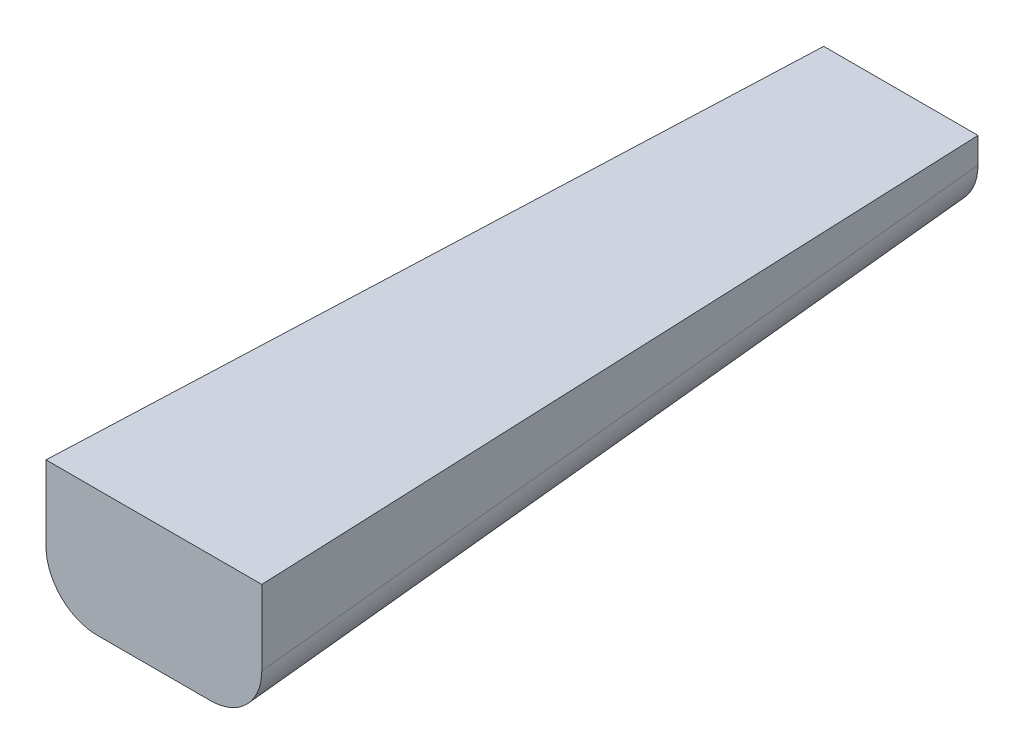
ISO-10303-21;
HEADER;
FILE_DESCRIPTION(('STEP AP214'),'2;1');
FILE_NAME('part.step','',(''),(''),'','','');
FILE_SCHEMA(('AUTOMOTIVE_DESIGN { 1 0 10303 214 1 1 1 1 }'));
ENDSEC;
DATA;
#1=APPLICATION_CONTEXT('core data for automotive mechanical design processes');
#2=APPLICATION_PROTOCOL_DEFINITION('international standard','automotive_design',2000,#1);
#3=PRODUCT_CONTEXT('',#1,'mechanical');
#4=PRODUCT('Part','Part','',(#3));
#5=PRODUCT_RELATED_PRODUCT_CATEGORY('part','',(#4));
#6=PRODUCT_DEFINITION_FORMATION('','',#4);
#7=PRODUCT_DEFINITION_CONTEXT('part definition',#1,'design');
#8=PRODUCT_DEFINITION('design','',#6,#7);
#9=PRODUCT_DEFINITION_SHAPE('','',#8);
#10=(LENGTH_UNIT() NAMED_UNIT(*) SI_UNIT(.MILLI.,.METRE.));
#11=(NAMED_UNIT(*) PLANE_ANGLE_UNIT() SI_UNIT($,.RADIAN.));
#12=(NAMED_UNIT(*) SI_UNIT($,.STERADIAN.) SOLID_ANGLE_UNIT());
#13=UNCERTAINTY_MEASURE_WITH_UNIT(LENGTH_MEASURE(1.E-05),#10,'distance_accuracy_value','');
#14=(GEOMETRIC_REPRESENTATION_CONTEXT(3) GLOBAL_UNCERTAINTY_ASSIGNED_CONTEXT((#13)) GLOBAL_UNIT_ASSIGNED_CONTEXT((#10,
#11,#12)) REPRESENTATION_CONTEXT('',''));
#15=CARTESIAN_POINT('',(0.,0.,0.));
#16=DIRECTION('',(0.,0.,1.));
#17=DIRECTION('',(1.,0.,0.));
#18=AXIS2_PLACEMENT_3D('',#15,#16,#17);
#19=CARTESIAN_POINT('',(0.,19.05,0.));
#20=DIRECTION('',(0.,1.,0.));
#21=DIRECTION('',(0.,0.,1.));
#22=AXIS2_PLACEMENT_3D('',#19,#20,#21);
#23=PLANE('',#22);
#24=DIRECTION('',(1.,0.,0.));
#25=VECTOR('',#24,1.);
#26=CARTESIAN_POINT('',(0.,19.05,-1152.2456));
#27=LINE('',#26,#25);
#28=CARTESIAN_POINT('',(-19.05,19.05,-1152.2456));
#29=VERTEX_POINT('',#28);
#30=CARTESIAN_POINT('',(19.05,19.05,-1152.2456));
#31=VERTEX_POINT('',#30);
#32=EDGE_CURVE('E112',#29,#31,#27,.T.);
#33=ORIENTED_EDGE('',*,*,#32,.F.);
#34=DIRECTION('',(-0.0411377422918956,0.,0.999153484785559));
#35=VECTOR('',#34,1.);
#36=CARTESIAN_POINT('',(-66.3784184874971,19.05,-2.732971775671));
#37=LINE('',#36,#35);
#38=CARTESIAN_POINT('',(-26.6456892184653,19.05,-967.761500261916));
#39=VERTEX_POINT('',#38);
#40=EDGE_CURVE('E111',#29,#39,#37,.T.);
#41=ORIENTED_EDGE('',*,*,#40,.T.);
#42=DIRECTION('',(-1.,0.,0.));
#43=VECTOR('',#42,1.);
#44=CARTESIAN_POINT('',(0.,19.05,-967.761500261916));
#45=LINE('',#44,#43);
#46=CARTESIAN_POINT('',(26.6456892184653,19.05,-967.761500261916));
#47=VERTEX_POINT('',#46);
#48=EDGE_CURVE('E100',#47,#39,#45,.T.);
#49=ORIENTED_EDGE('',*,*,#48,.F.);
#50=DIRECTION('',(-0.0411377422918955,0.,-0.999153484785559));
#51=VECTOR('',#50,1.);
#52=CARTESIAN_POINT('',(66.3784184874971,19.05,-2.73297177567099));
#53=LINE('',#52,#51);
#54=EDGE_CURVE('E109',#47,#31,#53,.T.);
#55=ORIENTED_EDGE('',*,*,#54,.T.);
#56=EDGE_LOOP('',(#33,#41,#49,#55));
#57=FACE_BOUND('',#56,.T.);
#58=ADVANCED_FACE('F45',(#57),#23,.T.);
#59=CARTESIAN_POINT('',(0.,0.,-967.761500261916));
#60=DIRECTION('',(0.,0.,1.));
#61=DIRECTION('',(1.,0.,0.));
#62=AXIS2_PLACEMENT_3D('',#59,#60,#61);
#63=PLANE('',#62);
#64=DIRECTION('',(0.,1.,0.));
#65=VECTOR('',#64,1.);
#66=CARTESIAN_POINT('',(26.6456892184653,0.,-967.761500261916));
#67=LINE('',#66,#65);
#68=CARTESIAN_POINT('',(26.6456892184653,0.540007355199504,-967.761500261916));
#69=VERTEX_POINT('',#68);
#70=EDGE_CURVE('E97',#69,#47,#67,.T.);
#71=ORIENTED_EDGE('',*,*,#70,.T.);
#72=ORIENTED_EDGE('',*,*,#48,.T.);
#73=DIRECTION('',(0.,-1.,0.));
#74=VECTOR('',#73,1.);
#75=CARTESIAN_POINT('',(-26.6456892184653,0.,-967.761500261916));
#76=LINE('',#75,#74);
#77=CARTESIAN_POINT('',(-26.6456892184653,0.540007355199476,-967.761500261916));
#78=VERTEX_POINT('',#77);
#79=EDGE_CURVE('E11',#39,#78,#76,.T.);
#80=ORIENTED_EDGE('',*,*,#79,.T.);
#81=CARTESIAN_POINT('',(-13.9349293668638,0.574424306919327,-967.761500261916));
#82=DIRECTION('',(0.,0.,1.));
#83=DIRECTION('',(-0.52999894000318,-0.847998304005088,0.));
#84=AXIS2_PLACEMENT_3D('',#81,#82,#83);
#85=ELLIPSE('',#84,12.738263656327,12.7);
#86=CARTESIAN_POINT('',(-13.9693009777976,-12.1531027495444,-967.761500261916));
#87=VERTEX_POINT('',#86);
#88=EDGE_CURVE('E190',#87,#78,#85,.F.);
#89=ORIENTED_EDGE('',*,*,#88,.F.);
#90=DIRECTION('',(1.,0.,0.));
#91=VECTOR('',#90,1.);
#92=CARTESIAN_POINT('',(0.,-12.1531027495444,-967.761500261916));
#93=LINE('',#92,#91);
#94=CARTESIAN_POINT('',(13.9693009777976,-12.1531027495444,-967.761500261916));
#95=VERTEX_POINT('',#94);
#96=EDGE_CURVE('E55',#87,#95,#93,.T.);
#97=ORIENTED_EDGE('',*,*,#96,.T.);
#98=CARTESIAN_POINT('',(13.9349293668638,0.574424306919341,-967.761500261916));
#99=DIRECTION('',(0.,0.,1.));
#100=DIRECTION('',(0.52999894000318,-0.847998304005088,0.));
#101=AXIS2_PLACEMENT_3D('',#98,#99,#100);
#102=ELLIPSE('',#101,12.738263656327,12.7);
#103=EDGE_CURVE('E63',#69,#95,#102,.F.);
#104=ORIENTED_EDGE('',*,*,#103,.F.);
#105=EDGE_LOOP('',(#71,#72,#80,#89,#97,#104));
#106=FACE_BOUND('',#105,.T.);
#107=ADVANCED_FACE('F99',(#106),#63,.T.);
#108=CARTESIAN_POINT('',(0.,0.,-1152.2456));
#109=DIRECTION('',(0.,0.,-1.));
#110=DIRECTION('',(-1.,0.,0.));
#111=AXIS2_PLACEMENT_3D('',#108,#109,#110);
#112=PLANE('',#111);
#113=DIRECTION('',(0.,1.,0.));
#114=VECTOR('',#113,1.);
#115=CARTESIAN_POINT('',(-19.05,50.8,-1152.2456));
#116=LINE('',#115,#114);
#117=CARTESIAN_POINT('',(-19.05,12.6931101047439,-1152.2456));
#118=VERTEX_POINT('',#117);
#119=EDGE_CURVE('E122',#118,#29,#116,.T.);
#120=ORIENTED_EDGE('',*,*,#119,.T.);
#121=ORIENTED_EDGE('',*,*,#32,.T.);
#122=DIRECTION('',(0.,-1.,0.));
#123=VECTOR('',#122,1.);
#124=CARTESIAN_POINT('',(19.05,50.8,-1152.2456));
#125=LINE('',#124,#123);
#126=CARTESIAN_POINT('',(19.05,12.6931101047439,-1152.2456));
#127=VERTEX_POINT('',#126);
#128=EDGE_CURVE('E115',#31,#127,#125,.T.);
#129=ORIENTED_EDGE('',*,*,#128,.T.);
#130=CARTESIAN_POINT('',(6.33924014839852,12.7275270564638,-1152.2456));
#131=DIRECTION('',(0.,0.,-1.));
#132=DIRECTION('',(0.52999894000318,-0.847998304005088,0.));
#133=AXIS2_PLACEMENT_3D('',#130,#131,#132);
#134=ELLIPSE('',#133,12.738263656327,12.7);
#135=CARTESIAN_POINT('',(6.37361175933236,0.,-1152.2456));
#136=VERTEX_POINT('',#135);
#137=EDGE_CURVE('E234',#127,#136,#134,.T.);
#138=ORIENTED_EDGE('',*,*,#137,.T.);
#139=DIRECTION('',(-1.,0.,0.));
#140=VECTOR('',#139,1.);
#141=CARTESIAN_POINT('',(19.05,0.,-1152.2456));
#142=LINE('',#141,#140);
#143=CARTESIAN_POINT('',(-6.37361175933236,0.,-1152.2456));
#144=VERTEX_POINT('',#143);
#145=EDGE_CURVE('E179',#136,#144,#142,.T.);
#146=ORIENTED_EDGE('',*,*,#145,.T.);
#147=CARTESIAN_POINT('',(-6.33924014839852,12.7275270564637,-1152.2456));
#148=DIRECTION('',(0.,0.,-1.));
#149=DIRECTION('',(-0.52999894000318,-0.847998304005088,0.));
#150=AXIS2_PLACEMENT_3D('',#147,#148,#149);
#151=ELLIPSE('',#150,12.738263656327,12.7);
#152=EDGE_CURVE('E214',#144,#118,#151,.T.);
#153=ORIENTED_EDGE('',*,*,#152,.T.);
#154=EDGE_LOOP('',(#120,#121,#129,#138,#146,#153));
#155=FACE_BOUND('',#154,.T.);
#156=ADVANCED_FACE('F154',(#155),#112,.T.);
#157=CARTESIAN_POINT('',(-66.3784184874971,0.,-2.732971775671));
#158=DIRECTION('',(0.999153484785559,0.,0.0411377422918956));
#159=DIRECTION('',(0.0411377422918956,0.,-0.999153484785559));
#160=AXIS2_PLACEMENT_3D('',#157,#158,#159);
#161=PLANE('',#160);
#162=ORIENTED_EDGE('',*,*,#40,.F.);
#163=ORIENTED_EDGE('',*,*,#119,.F.);
#164=DIRECTION('',(-0.0410489197913281,-0.0656782716661249,0.996996163891775));
#165=VECTOR('',#164,1.);
#166=CARTESIAN_POINT('',(-66.2084818529802,-62.7604608600244,-6.86039275481799));
#167=LINE('',#166,#165);
#168=EDGE_CURVE('E217',#118,#78,#167,.T.);
#169=ORIENTED_EDGE('',*,*,#168,.T.);
#170=ORIENTED_EDGE('',*,*,#79,.F.);
#171=EDGE_LOOP('',(#162,#163,#169,#170));
#172=FACE_BOUND('',#171,.T.);
#173=ADVANCED_FACE('F47',(#172),#161,.F.);
#174=CARTESIAN_POINT('',(66.3784184874971,0.,-2.73297177567099));
#175=DIRECTION('',(-0.999153484785559,0.,0.0411377422918955));
#176=DIRECTION('',(0.0411377422918955,0.,0.999153484785559));
#177=AXIS2_PLACEMENT_3D('',#174,#175,#176);
#178=PLANE('',#177);
#179=ORIENTED_EDGE('',*,*,#54,.F.);
#180=ORIENTED_EDGE('',*,*,#70,.F.);
#181=DIRECTION('',(0.041048919791328,-0.0656782716661249,0.996996163891775));
#182=VECTOR('',#181,1.);
#183=CARTESIAN_POINT('',(66.2084818529801,-62.7604608600243,-6.86039275481798));
#184=LINE('',#183,#182);
#185=EDGE_CURVE('E221',#69,#127,#184,.F.);
#186=ORIENTED_EDGE('',*,*,#185,.T.);
#187=ORIENTED_EDGE('',*,*,#128,.F.);
#188=EDGE_LOOP('',(#179,#180,#186,#187));
#189=FACE_BOUND('',#188,.T.);
#190=ADVANCED_FACE('F114',(#189),#178,.F.);
#191=CARTESIAN_POINT('',(0.,-75.5775259125343,-4.97875664772953));
#192=DIRECTION('',(0.,0.997837203068467,0.0657336760914669));
#193=DIRECTION('',(0.,-0.0657336760914669,0.997837203068468));
#194=AXIS2_PLACEMENT_3D('',#191,#192,#193);
#195=PLANE('',#194);
#196=ORIENTED_EDGE('',*,*,#96,.F.);
#197=DIRECTION('',(-0.0410489197913281,-0.0656782716661249,0.996996163891775));
#198=VECTOR('',#197,1.);
#199=CARTESIAN_POINT('',(-53.5192325962036,-75.4329933389939,-7.17276111407254));
#200=LINE('',#199,#198);
#201=EDGE_CURVE('E211',#87,#144,#200,.F.);
#202=ORIENTED_EDGE('',*,*,#201,.T.);
#203=ORIENTED_EDGE('',*,*,#145,.F.);
#204=DIRECTION('',(0.041048919791328,-0.0656782716661249,0.996996163891775));
#205=VECTOR('',#204,1.);
#206=CARTESIAN_POINT('',(53.5192325962035,-75.4329933389939,-7.17276111407254));
#207=LINE('',#206,#205);
#208=EDGE_CURVE('E184',#136,#95,#207,.T.);
#209=ORIENTED_EDGE('',*,*,#208,.T.);
#210=EDGE_LOOP('',(#196,#202,#203,#209));
#211=FACE_BOUND('',#210,.T.);
#212=ADVANCED_FACE('F152',(#211),#195,.F.);
#213=CARTESIAN_POINT('',(-53.5192325962036,-62.7604608600244,-6.33794342771091));
#214=DIRECTION('',(-0.0410489197913281,-0.0656782716661249,0.996996163891775));
#215=DIRECTION('',(0.,-0.997837203068467,-0.0657336760914669));
#216=AXIS2_PLACEMENT_3D('',#213,#214,#215);
#217=CYLINDRICAL_SURFACE('',#216,12.7);
#218=ORIENTED_EDGE('',*,*,#201,.F.);
#219=ORIENTED_EDGE('',*,*,#88,.T.);
#220=ORIENTED_EDGE('',*,*,#168,.F.);
#221=ORIENTED_EDGE('',*,*,#152,.F.);
#222=EDGE_LOOP('',(#218,#219,#220,#221));
#223=FACE_BOUND('',#222,.T.);
#224=ADVANCED_FACE('F200',(#223),#217,.T.);
#225=CARTESIAN_POINT('',(53.5192325962035,-62.7604608600243,-6.33794342771091));
#226=DIRECTION('',(0.041048919791328,-0.0656782716661249,0.996996163891775));
#227=DIRECTION('',(0.,-0.997837203068468,-0.0657336760914669));
#228=AXIS2_PLACEMENT_3D('',#225,#226,#227);
#229=CYLINDRICAL_SURFACE('',#228,12.7);
#230=ORIENTED_EDGE('',*,*,#185,.F.);
#231=ORIENTED_EDGE('',*,*,#103,.T.);
#232=ORIENTED_EDGE('',*,*,#208,.F.);
#233=ORIENTED_EDGE('',*,*,#137,.F.);
#234=EDGE_LOOP('',(#230,#231,#232,#233));
#235=FACE_BOUND('',#234,.T.);
#236=ADVANCED_FACE('F201',(#235),#229,.T.);
#237=CLOSED_SHELL('',(#58,#107,#156,#173,#190,#212,#224,#236));
#238=MANIFOLD_SOLID_BREP('B2',#237);
#239=ADVANCED_BREP_SHAPE_REPRESENTATION('',(#18,#238),#14);
#240=SHAPE_DEFINITION_REPRESENTATION(#9,#239);
ENDSEC;
END-ISO-10303-21;
